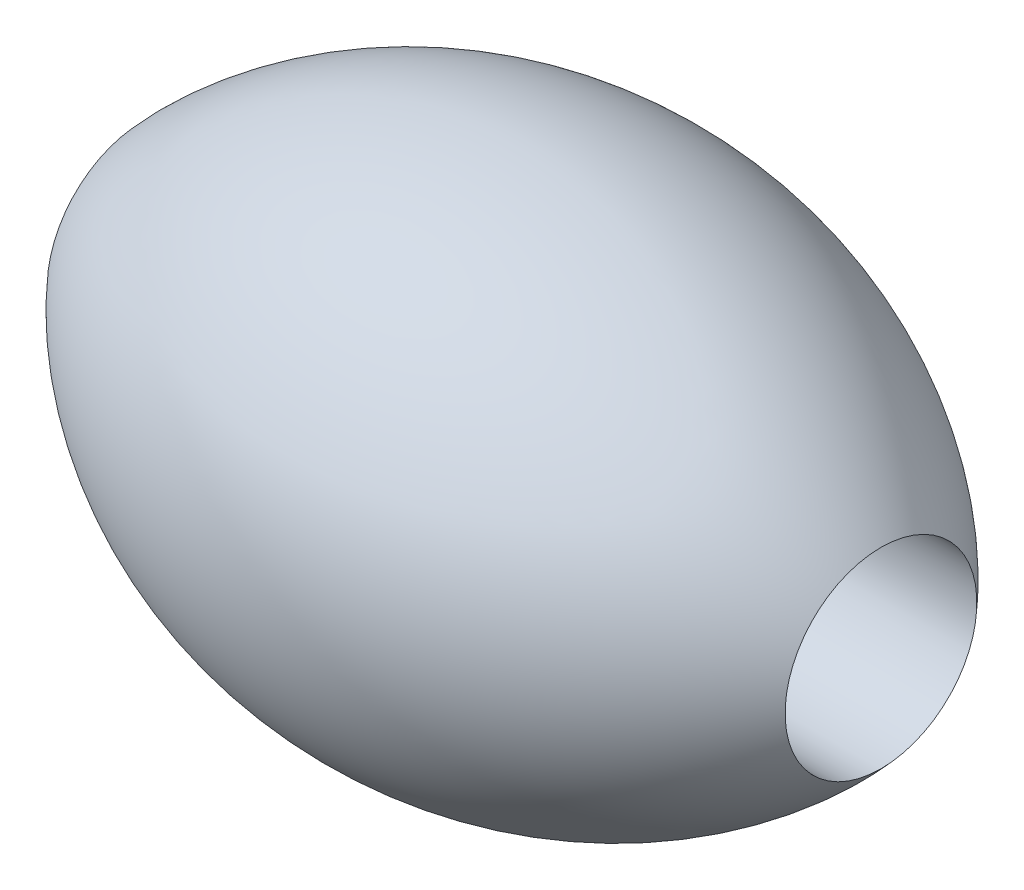
ISO-10303-21;
HEADER;
FILE_DESCRIPTION(('STEP AP214'),'2;1');
FILE_NAME('part.step','',(''),(''),'','','');
FILE_SCHEMA(('AUTOMOTIVE_DESIGN { 1 0 10303 214 1 1 1 1 }'));
ENDSEC;
DATA;
#1=APPLICATION_CONTEXT('core data for automotive mechanical design processes');
#2=APPLICATION_PROTOCOL_DEFINITION('international standard','automotive_design',2000,#1);
#3=PRODUCT_CONTEXT('',#1,'mechanical');
#4=PRODUCT('Part','Part','',(#3));
#5=PRODUCT_RELATED_PRODUCT_CATEGORY('part','',(#4));
#6=PRODUCT_DEFINITION_FORMATION('','',#4);
#7=PRODUCT_DEFINITION_CONTEXT('part definition',#1,'design');
#8=PRODUCT_DEFINITION('design','',#6,#7);
#9=PRODUCT_DEFINITION_SHAPE('','',#8);
#10=(LENGTH_UNIT() NAMED_UNIT(*) SI_UNIT(.MILLI.,.METRE.));
#11=(NAMED_UNIT(*) PLANE_ANGLE_UNIT() SI_UNIT($,.RADIAN.));
#12=(NAMED_UNIT(*) SI_UNIT($,.STERADIAN.) SOLID_ANGLE_UNIT());
#13=UNCERTAINTY_MEASURE_WITH_UNIT(LENGTH_MEASURE(1.E-05),#10,'distance_accuracy_value','');
#14=(GEOMETRIC_REPRESENTATION_CONTEXT(3) GLOBAL_UNCERTAINTY_ASSIGNED_CONTEXT((#13)) GLOBAL_UNIT_ASSIGNED_CONTEXT((#10,
#11,#12)) REPRESENTATION_CONTEXT('',''));
#15=CARTESIAN_POINT('',(0.,0.,0.));
#16=DIRECTION('',(0.,0.,1.));
#17=DIRECTION('',(1.,0.,0.));
#18=AXIS2_PLACEMENT_3D('',#15,#16,#17);
#19=CARTESIAN_POINT('',(-0.537034775401333,0.,0.));
#20=DIRECTION('',(-1.,0.,0.));
#21=DIRECTION('',(0.,-1.,0.));
#22=AXIS2_PLACEMENT_3D('',#19,#20,#21);
#23=DEGENERATE_TOROIDAL_SURFACE('',#22,2.66666666666667,5.66666666666667,.F.);
#24=CARTESIAN_POINT('',(-4.77063056779027,0.,0.));
#25=DIRECTION('',(1.,0.,0.));
#26=DIRECTION('',(0.,1.,0.));
#27=AXIS2_PLACEMENT_3D('',#24,#25,#26);
#28=CIRCLE('',#27,1.1);
#29=CARTESIAN_POINT('',(-4.77063056779027,1.1,0.));
#30=VERTEX_POINT('',#29);
#31=EDGE_CURVE('E10',#30,#30,#28,.T.);
#32=ORIENTED_EDGE('',*,*,#31,.T.);
#33=EDGE_LOOP('',(#32));
#34=FACE_BOUND('',#33,.T.);
#35=CARTESIAN_POINT('',(3.69656101698761,0.,0.));
#36=DIRECTION('',(-1.,0.,0.));
#37=DIRECTION('',(0.,-1.,0.));
#38=AXIS2_PLACEMENT_3D('',#35,#36,#37);
#39=CIRCLE('',#38,1.1);
#40=CARTESIAN_POINT('',(3.69656101698761,-1.1,0.));
#41=VERTEX_POINT('',#40);
#42=EDGE_CURVE('E40',#41,#41,#39,.T.);
#43=ORIENTED_EDGE('',*,*,#42,.T.);
#44=EDGE_LOOP('',(#43));
#45=FACE_BOUND('',#44,.T.);
#46=ADVANCED_FACE('F34',(#34,#45),#23,.F.);
#47=CARTESIAN_POINT('',(-5.53703477540133,0.,0.));
#48=DIRECTION('',(1.,0.,0.));
#49=DIRECTION('',(0.,0.,-1.));
#50=AXIS2_PLACEMENT_3D('',#47,#48,#49);
#51=CYLINDRICAL_SURFACE('',#50,1.1);
#52=ORIENTED_EDGE('',*,*,#42,.F.);
#53=EDGE_LOOP('',(#52));
#54=FACE_BOUND('',#53,.T.);
#55=ORIENTED_EDGE('',*,*,#31,.F.);
#56=EDGE_LOOP('',(#55));
#57=FACE_BOUND('',#56,.T.);
#58=ADVANCED_FACE('F47',(#54,#57),#51,.F.);
#59=CLOSED_SHELL('',(#46,#58));
#60=MANIFOLD_SOLID_BREP('B2',#59);
#61=ADVANCED_BREP_SHAPE_REPRESENTATION('',(#18,#60),#14);
#62=SHAPE_DEFINITION_REPRESENTATION(#9,#61);
ENDSEC;
END-ISO-10303-21;
